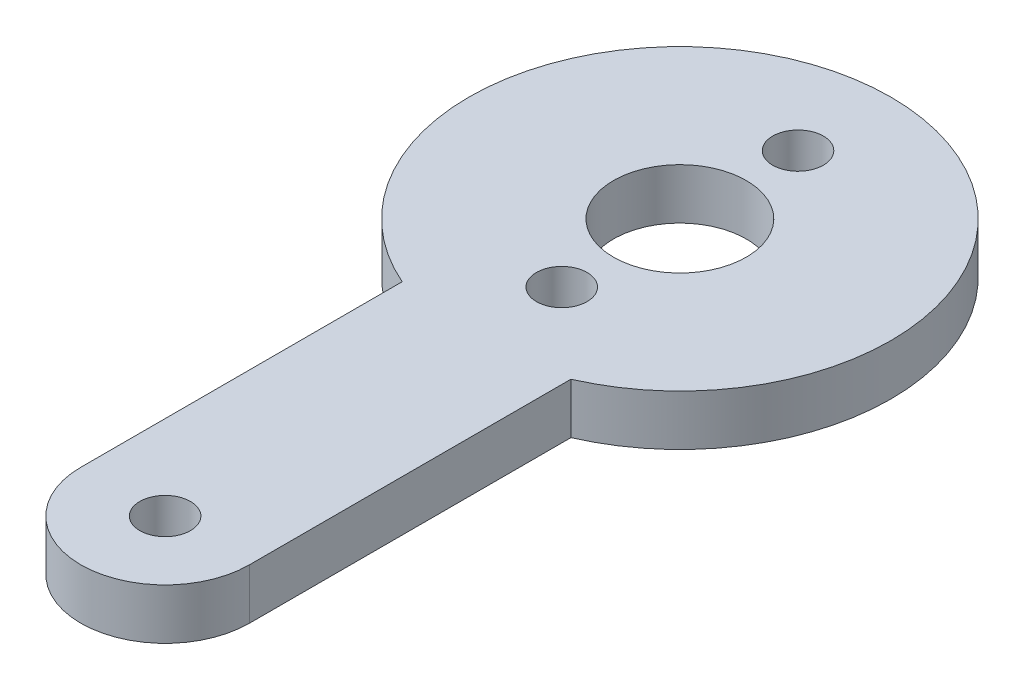
ISO-10303-21;
HEADER;
FILE_DESCRIPTION(('STEP AP214'),'2;1');
FILE_NAME('part.step','',(''),(''),'','','');
FILE_SCHEMA(('AUTOMOTIVE_DESIGN { 1 0 10303 214 1 1 1 1 }'));
ENDSEC;
DATA;
#1=APPLICATION_CONTEXT('core data for automotive mechanical design processes');
#2=APPLICATION_PROTOCOL_DEFINITION('international standard','automotive_design',2000,#1);
#3=PRODUCT_CONTEXT('',#1,'mechanical');
#4=PRODUCT('Part','Part','',(#3));
#5=PRODUCT_RELATED_PRODUCT_CATEGORY('part','',(#4));
#6=PRODUCT_DEFINITION_FORMATION('','',#4);
#7=PRODUCT_DEFINITION_CONTEXT('part definition',#1,'design');
#8=PRODUCT_DEFINITION('design','',#6,#7);
#9=PRODUCT_DEFINITION_SHAPE('','',#8);
#10=(LENGTH_UNIT() NAMED_UNIT(*) SI_UNIT(.MILLI.,.METRE.));
#11=(NAMED_UNIT(*) PLANE_ANGLE_UNIT() SI_UNIT($,.RADIAN.));
#12=(NAMED_UNIT(*) SI_UNIT($,.STERADIAN.) SOLID_ANGLE_UNIT());
#13=UNCERTAINTY_MEASURE_WITH_UNIT(LENGTH_MEASURE(1.E-05),#10,'distance_accuracy_value','');
#14=(GEOMETRIC_REPRESENTATION_CONTEXT(3) GLOBAL_UNCERTAINTY_ASSIGNED_CONTEXT((#13)) GLOBAL_UNIT_ASSIGNED_CONTEXT((#10,
#11,#12)) REPRESENTATION_CONTEXT('',''));
#15=CARTESIAN_POINT('',(0.,0.,0.));
#16=DIRECTION('',(0.,0.,1.));
#17=DIRECTION('',(1.,0.,0.));
#18=AXIS2_PLACEMENT_3D('',#15,#16,#17);
#19=CARTESIAN_POINT('',(-5.,3.,0.));
#20=DIRECTION('',(1.,0.,0.));
#21=DIRECTION('',(0.,0.,-1.));
#22=AXIS2_PLACEMENT_3D('',#19,#20,#21);
#23=PLANE('',#22);
#24=DIRECTION('',(0.,0.,1.));
#25=VECTOR('',#24,1.);
#26=CARTESIAN_POINT('',(-5.,0.,0.));
#27=LINE('',#26,#25);
#28=CARTESIAN_POINT('',(-5.,0.,11.4564392373896));
#29=VERTEX_POINT('',#28);
#30=CARTESIAN_POINT('',(-5.,0.,30.5));
#31=VERTEX_POINT('',#30);
#32=EDGE_CURVE('E110',#29,#31,#27,.T.);
#33=ORIENTED_EDGE('',*,*,#32,.T.);
#34=DIRECTION('',(0.,-1.,0.));
#35=VECTOR('',#34,1.);
#36=CARTESIAN_POINT('',(-5.,3.,30.5));
#37=LINE('',#36,#35);
#38=CARTESIAN_POINT('',(-5.,3.,30.5));
#39=VERTEX_POINT('',#38);
#40=EDGE_CURVE('E11',#39,#31,#37,.T.);
#41=ORIENTED_EDGE('',*,*,#40,.F.);
#42=DIRECTION('',(0.,0.,1.));
#43=VECTOR('',#42,1.);
#44=CARTESIAN_POINT('',(-5.,3.,0.));
#45=LINE('',#44,#43);
#46=CARTESIAN_POINT('',(-5.,3.,11.4564392373896));
#47=VERTEX_POINT('',#46);
#48=EDGE_CURVE('E84',#47,#39,#45,.T.);
#49=ORIENTED_EDGE('',*,*,#48,.F.);
#50=DIRECTION('',(0.,-1.,0.));
#51=VECTOR('',#50,1.);
#52=CARTESIAN_POINT('',(-5.,3.,11.4564392373896));
#53=LINE('',#52,#51);
#54=EDGE_CURVE('E51',#47,#29,#53,.T.);
#55=ORIENTED_EDGE('',*,*,#54,.T.);
#56=EDGE_LOOP('',(#33,#41,#49,#55));
#57=FACE_BOUND('',#56,.T.);
#58=ADVANCED_FACE('F34',(#57),#23,.F.);
#59=CARTESIAN_POINT('',(0.,3.,30.5));
#60=DIRECTION('',(0.,-1.,0.));
#61=DIRECTION('',(0.,0.,-1.));
#62=AXIS2_PLACEMENT_3D('',#59,#60,#61);
#63=CYLINDRICAL_SURFACE('',#62,5.);
#64=CARTESIAN_POINT('',(0.,0.,30.5));
#65=DIRECTION('',(0.,1.,0.));
#66=DIRECTION('',(0.,0.,1.));
#67=AXIS2_PLACEMENT_3D('',#64,#65,#66);
#68=CIRCLE('',#67,5.);
#69=CARTESIAN_POINT('',(5.,0.,30.5));
#70=VERTEX_POINT('',#69);
#71=EDGE_CURVE('E89',#31,#70,#68,.T.);
#72=ORIENTED_EDGE('',*,*,#71,.T.);
#73=DIRECTION('',(0.,-1.,0.));
#74=VECTOR('',#73,1.);
#75=CARTESIAN_POINT('',(5.,3.,30.5));
#76=LINE('',#75,#74);
#77=CARTESIAN_POINT('',(5.,3.,30.5));
#78=VERTEX_POINT('',#77);
#79=EDGE_CURVE('E43',#78,#70,#76,.T.);
#80=ORIENTED_EDGE('',*,*,#79,.F.);
#81=CARTESIAN_POINT('',(0.,3.,30.5));
#82=DIRECTION('',(0.,1.,0.));
#83=DIRECTION('',(0.,0.,1.));
#84=AXIS2_PLACEMENT_3D('',#81,#82,#83);
#85=CIRCLE('',#84,5.);
#86=EDGE_CURVE('E77',#39,#78,#85,.T.);
#87=ORIENTED_EDGE('',*,*,#86,.F.);
#88=ORIENTED_EDGE('',*,*,#40,.T.);
#89=EDGE_LOOP('',(#72,#80,#87,#88));
#90=FACE_BOUND('',#89,.T.);
#91=ADVANCED_FACE('F88',(#90),#63,.T.);
#92=CARTESIAN_POINT('',(5.,3.,0.));
#93=DIRECTION('',(-1.,0.,0.));
#94=DIRECTION('',(0.,0.,1.));
#95=AXIS2_PLACEMENT_3D('',#92,#93,#94);
#96=PLANE('',#95);
#97=DIRECTION('',(0.,0.,-1.));
#98=VECTOR('',#97,1.);
#99=CARTESIAN_POINT('',(5.,0.,0.));
#100=LINE('',#99,#98);
#101=CARTESIAN_POINT('',(5.,0.,11.4564392373896));
#102=VERTEX_POINT('',#101);
#103=EDGE_CURVE('E113',#70,#102,#100,.T.);
#104=ORIENTED_EDGE('',*,*,#103,.T.);
#105=DIRECTION('',(0.,-1.,0.));
#106=VECTOR('',#105,1.);
#107=CARTESIAN_POINT('',(5.,3.,11.4564392373896));
#108=LINE('',#107,#106);
#109=CARTESIAN_POINT('',(5.,3.,11.4564392373896));
#110=VERTEX_POINT('',#109);
#111=EDGE_CURVE('E66',#110,#102,#108,.T.);
#112=ORIENTED_EDGE('',*,*,#111,.F.);
#113=DIRECTION('',(0.,0.,-1.));
#114=VECTOR('',#113,1.);
#115=CARTESIAN_POINT('',(5.,3.,0.));
#116=LINE('',#115,#114);
#117=EDGE_CURVE('E83',#78,#110,#116,.T.);
#118=ORIENTED_EDGE('',*,*,#117,.F.);
#119=ORIENTED_EDGE('',*,*,#79,.T.);
#120=EDGE_LOOP('',(#104,#112,#118,#119));
#121=FACE_BOUND('',#120,.T.);
#122=ADVANCED_FACE('F92',(#121),#96,.F.);
#123=CARTESIAN_POINT('',(0.,3.,0.));
#124=DIRECTION('',(0.,-1.,0.));
#125=DIRECTION('',(0.,0.,-1.));
#126=AXIS2_PLACEMENT_3D('',#123,#124,#125);
#127=CYLINDRICAL_SURFACE('',#126,3.935);
#128=CARTESIAN_POINT('',(0.,3.,0.));
#129=DIRECTION('',(0.,1.,0.));
#130=DIRECTION('',(0.,0.,1.));
#131=AXIS2_PLACEMENT_3D('',#128,#129,#130);
#132=CIRCLE('',#131,3.935);
#133=CARTESIAN_POINT('',(0.,3.,3.935));
#134=VERTEX_POINT('',#133);
#135=EDGE_CURVE('E132',#134,#134,#132,.T.);
#136=ORIENTED_EDGE('',*,*,#135,.T.);
#137=EDGE_LOOP('',(#136));
#138=FACE_BOUND('',#137,.T.);
#139=CARTESIAN_POINT('',(0.,0.,0.));
#140=DIRECTION('',(0.,1.,0.));
#141=DIRECTION('',(0.,0.,1.));
#142=AXIS2_PLACEMENT_3D('',#139,#140,#141);
#143=CIRCLE('',#142,3.935);
#144=CARTESIAN_POINT('',(0.,0.,3.935));
#145=VERTEX_POINT('',#144);
#146=EDGE_CURVE('E107',#145,#145,#143,.T.);
#147=ORIENTED_EDGE('',*,*,#146,.F.);
#148=EDGE_LOOP('',(#147));
#149=FACE_BOUND('',#148,.T.);
#150=ADVANCED_FACE('F136',(#138,#149),#127,.F.);
#151=CARTESIAN_POINT('',(0.,3.,-7.));
#152=DIRECTION('',(0.,-1.,0.));
#153=DIRECTION('',(0.,0.,-1.));
#154=AXIS2_PLACEMENT_3D('',#151,#152,#153);
#155=CYLINDRICAL_SURFACE('',#154,1.5);
#156=CARTESIAN_POINT('',(0.,3.,-7.));
#157=DIRECTION('',(0.,1.,0.));
#158=DIRECTION('',(0.,0.,1.));
#159=AXIS2_PLACEMENT_3D('',#156,#157,#158);
#160=CIRCLE('',#159,1.5);
#161=CARTESIAN_POINT('',(0.,3.,-5.5));
#162=VERTEX_POINT('',#161);
#163=EDGE_CURVE('E127',#162,#162,#160,.T.);
#164=ORIENTED_EDGE('',*,*,#163,.T.);
#165=EDGE_LOOP('',(#164));
#166=FACE_BOUND('',#165,.T.);
#167=CARTESIAN_POINT('',(0.,0.,-7.));
#168=DIRECTION('',(0.,1.,0.));
#169=DIRECTION('',(0.,0.,1.));
#170=AXIS2_PLACEMENT_3D('',#167,#168,#169);
#171=CIRCLE('',#170,1.5);
#172=CARTESIAN_POINT('',(0.,0.,-5.5));
#173=VERTEX_POINT('',#172);
#174=EDGE_CURVE('E104',#173,#173,#171,.T.);
#175=ORIENTED_EDGE('',*,*,#174,.F.);
#176=EDGE_LOOP('',(#175));
#177=FACE_BOUND('',#176,.T.);
#178=ADVANCED_FACE('F162',(#166,#177),#155,.F.);
#179=CARTESIAN_POINT('',(0.,3.,7.));
#180=DIRECTION('',(0.,-1.,0.));
#181=DIRECTION('',(0.,0.,-1.));
#182=AXIS2_PLACEMENT_3D('',#179,#180,#181);
#183=CYLINDRICAL_SURFACE('',#182,1.5);
#184=CARTESIAN_POINT('',(0.,3.,7.));
#185=DIRECTION('',(0.,1.,0.));
#186=DIRECTION('',(0.,0.,1.));
#187=AXIS2_PLACEMENT_3D('',#184,#185,#186);
#188=CIRCLE('',#187,1.5);
#189=CARTESIAN_POINT('',(0.,3.,8.5));
#190=VERTEX_POINT('',#189);
#191=EDGE_CURVE('E122',#190,#190,#188,.T.);
#192=ORIENTED_EDGE('',*,*,#191,.T.);
#193=EDGE_LOOP('',(#192));
#194=FACE_BOUND('',#193,.T.);
#195=CARTESIAN_POINT('',(0.,0.,7.));
#196=DIRECTION('',(0.,1.,0.));
#197=DIRECTION('',(0.,0.,1.));
#198=AXIS2_PLACEMENT_3D('',#195,#196,#197);
#199=CIRCLE('',#198,1.5);
#200=CARTESIAN_POINT('',(0.,0.,8.5));
#201=VERTEX_POINT('',#200);
#202=EDGE_CURVE('E101',#201,#201,#199,.T.);
#203=ORIENTED_EDGE('',*,*,#202,.F.);
#204=EDGE_LOOP('',(#203));
#205=FACE_BOUND('',#204,.T.);
#206=ADVANCED_FACE('F164',(#194,#205),#183,.F.);
#207=CARTESIAN_POINT('',(0.,3.,30.5));
#208=DIRECTION('',(0.,-1.,0.));
#209=DIRECTION('',(0.,0.,-1.));
#210=AXIS2_PLACEMENT_3D('',#207,#208,#209);
#211=CYLINDRICAL_SURFACE('',#210,1.5);
#212=CARTESIAN_POINT('',(0.,3.,30.5));
#213=DIRECTION('',(0.,1.,0.));
#214=DIRECTION('',(0.,0.,1.));
#215=AXIS2_PLACEMENT_3D('',#212,#213,#214);
#216=CIRCLE('',#215,1.5);
#217=CARTESIAN_POINT('',(0.,3.,32.));
#218=VERTEX_POINT('',#217);
#219=EDGE_CURVE('E118',#218,#218,#216,.T.);
#220=ORIENTED_EDGE('',*,*,#219,.T.);
#221=EDGE_LOOP('',(#220));
#222=FACE_BOUND('',#221,.T.);
#223=CARTESIAN_POINT('',(0.,0.,30.5));
#224=DIRECTION('',(0.,1.,0.));
#225=DIRECTION('',(0.,0.,1.));
#226=AXIS2_PLACEMENT_3D('',#223,#224,#225);
#227=CIRCLE('',#226,1.5);
#228=CARTESIAN_POINT('',(0.,0.,32.));
#229=VERTEX_POINT('',#228);
#230=EDGE_CURVE('E98',#229,#229,#227,.T.);
#231=ORIENTED_EDGE('',*,*,#230,.F.);
#232=EDGE_LOOP('',(#231));
#233=FACE_BOUND('',#232,.T.);
#234=ADVANCED_FACE('F36',(#222,#233),#211,.F.);
#235=CARTESIAN_POINT('',(0.,3.,0.));
#236=DIRECTION('',(0.,-1.,0.));
#237=DIRECTION('',(0.,0.,-1.));
#238=AXIS2_PLACEMENT_3D('',#235,#236,#237);
#239=CYLINDRICAL_SURFACE('',#238,12.5);
#240=CARTESIAN_POINT('',(0.,0.,0.));
#241=DIRECTION('',(0.,1.,0.));
#242=DIRECTION('',(0.,0.,1.));
#243=AXIS2_PLACEMENT_3D('',#240,#241,#242);
#244=CIRCLE('',#243,12.5);
#245=EDGE_CURVE('E115',#29,#102,#244,.F.);
#246=ORIENTED_EDGE('',*,*,#245,.F.);
#247=ORIENTED_EDGE('',*,*,#54,.F.);
#248=CARTESIAN_POINT('',(0.,3.,0.));
#249=DIRECTION('',(0.,1.,0.));
#250=DIRECTION('',(0.,0.,1.));
#251=AXIS2_PLACEMENT_3D('',#248,#249,#250);
#252=CIRCLE('',#251,12.5);
#253=EDGE_CURVE('E93',#47,#110,#252,.F.);
#254=ORIENTED_EDGE('',*,*,#253,.T.);
#255=ORIENTED_EDGE('',*,*,#111,.T.);
#256=EDGE_LOOP('',(#246,#247,#254,#255));
#257=FACE_BOUND('',#256,.T.);
#258=ADVANCED_FACE('F141',(#257),#239,.T.);
#259=CARTESIAN_POINT('',(0.,3.,0.));
#260=DIRECTION('',(0.,1.,0.));
#261=DIRECTION('',(0.,0.,1.));
#262=AXIS2_PLACEMENT_3D('',#259,#260,#261);
#263=PLANE('',#262);
#264=ORIENTED_EDGE('',*,*,#219,.F.);
#265=EDGE_LOOP('',(#264));
#266=FACE_BOUND('',#265,.T.);
#267=ORIENTED_EDGE('',*,*,#191,.F.);
#268=EDGE_LOOP('',(#267));
#269=FACE_BOUND('',#268,.T.);
#270=ORIENTED_EDGE('',*,*,#163,.F.);
#271=EDGE_LOOP('',(#270));
#272=FACE_BOUND('',#271,.T.);
#273=ORIENTED_EDGE('',*,*,#135,.F.);
#274=EDGE_LOOP('',(#273));
#275=FACE_BOUND('',#274,.T.);
#276=ORIENTED_EDGE('',*,*,#48,.T.);
#277=ORIENTED_EDGE('',*,*,#86,.T.);
#278=ORIENTED_EDGE('',*,*,#117,.T.);
#279=ORIENTED_EDGE('',*,*,#253,.F.);
#280=EDGE_LOOP('',(#276,#277,#278,#279));
#281=FACE_BOUND('',#280,.T.);
#282=ADVANCED_FACE('F80',(#266,#269,#272,#275,#281),#263,.T.);
#283=CARTESIAN_POINT('',(0.,0.,0.));
#284=DIRECTION('',(0.,1.,0.));
#285=DIRECTION('',(0.,0.,1.));
#286=AXIS2_PLACEMENT_3D('',#283,#284,#285);
#287=PLANE('',#286);
#288=ORIENTED_EDGE('',*,*,#230,.T.);
#289=EDGE_LOOP('',(#288));
#290=FACE_BOUND('',#289,.T.);
#291=ORIENTED_EDGE('',*,*,#202,.T.);
#292=EDGE_LOOP('',(#291));
#293=FACE_BOUND('',#292,.T.);
#294=ORIENTED_EDGE('',*,*,#174,.T.);
#295=EDGE_LOOP('',(#294));
#296=FACE_BOUND('',#295,.T.);
#297=ORIENTED_EDGE('',*,*,#146,.T.);
#298=EDGE_LOOP('',(#297));
#299=FACE_BOUND('',#298,.T.);
#300=ORIENTED_EDGE('',*,*,#32,.F.);
#301=ORIENTED_EDGE('',*,*,#245,.T.);
#302=ORIENTED_EDGE('',*,*,#103,.F.);
#303=ORIENTED_EDGE('',*,*,#71,.F.);
#304=EDGE_LOOP('',(#300,#301,#302,#303));
#305=FACE_BOUND('',#304,.T.);
#306=ADVANCED_FACE('F140',(#290,#293,#296,#299,#305),#287,.F.);
#307=CLOSED_SHELL('',(#58,#91,#122,#150,#178,#206,#234,#258,#282,#306));
#308=MANIFOLD_SOLID_BREP('B2',#307);
#309=ADVANCED_BREP_SHAPE_REPRESENTATION('',(#18,#308),#14);
#310=SHAPE_DEFINITION_REPRESENTATION(#9,#309);
ENDSEC;
END-ISO-10303-21;
